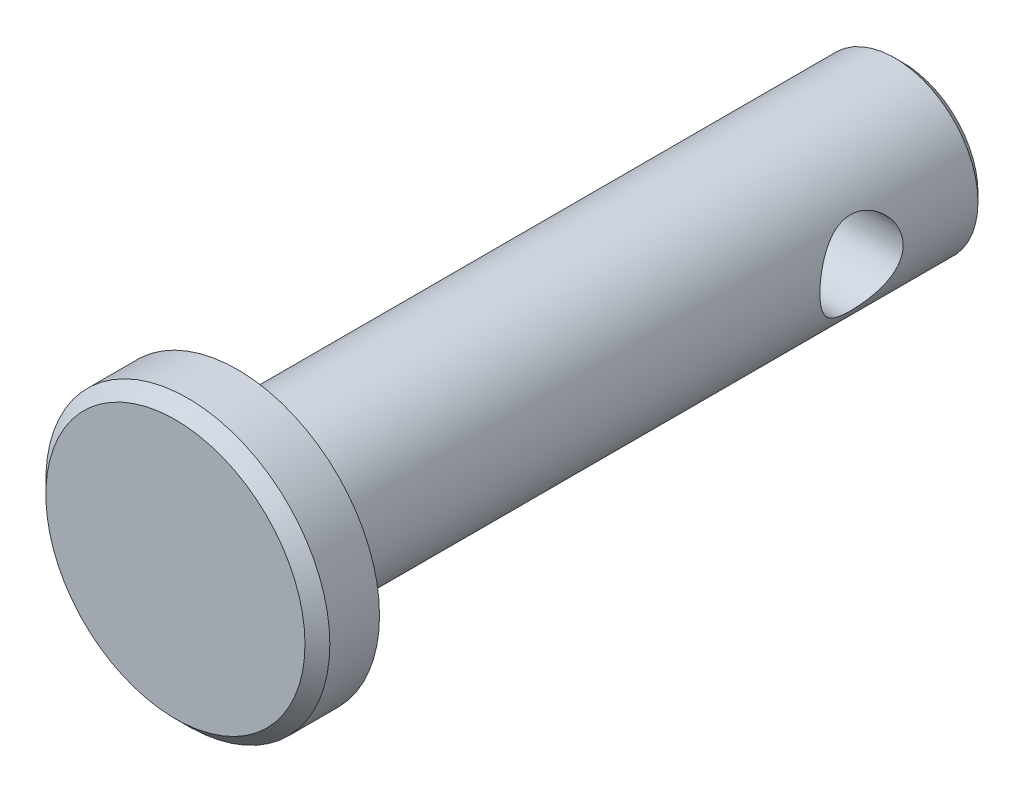
ISO-10303-21;
HEADER;
FILE_DESCRIPTION(('STEP AP214'),'2;1');
FILE_NAME('part.step','',(''),(''),'','','');
FILE_SCHEMA(('AUTOMOTIVE_DESIGN { 1 0 10303 214 1 1 1 1 }'));
ENDSEC;
DATA;
#1=APPLICATION_CONTEXT('core data for automotive mechanical design processes');
#2=APPLICATION_PROTOCOL_DEFINITION('international standard','automotive_design',2000,#1);
#3=PRODUCT_CONTEXT('',#1,'mechanical');
#4=PRODUCT('Part','Part','',(#3));
#5=PRODUCT_RELATED_PRODUCT_CATEGORY('part','',(#4));
#6=PRODUCT_DEFINITION_FORMATION('','',#4);
#7=PRODUCT_DEFINITION_CONTEXT('part definition',#1,'design');
#8=PRODUCT_DEFINITION('design','',#6,#7);
#9=PRODUCT_DEFINITION_SHAPE('','',#8);
#10=(LENGTH_UNIT() NAMED_UNIT(*) SI_UNIT(.MILLI.,.METRE.));
#11=(NAMED_UNIT(*) PLANE_ANGLE_UNIT() SI_UNIT($,.RADIAN.));
#12=(NAMED_UNIT(*) SI_UNIT($,.STERADIAN.) SOLID_ANGLE_UNIT());
#13=UNCERTAINTY_MEASURE_WITH_UNIT(LENGTH_MEASURE(1.E-05),#10,'distance_accuracy_value','');
#14=(GEOMETRIC_REPRESENTATION_CONTEXT(3) GLOBAL_UNCERTAINTY_ASSIGNED_CONTEXT((#13)) GLOBAL_UNIT_ASSIGNED_CONTEXT((#10,
#11,#12)) REPRESENTATION_CONTEXT('',''));
#15=CARTESIAN_POINT('',(0.,0.,0.));
#16=DIRECTION('',(0.,0.,1.));
#17=DIRECTION('',(1.,0.,0.));
#18=AXIS2_PLACEMENT_3D('',#15,#16,#17);
#19=CARTESIAN_POINT('',(0.,0.,9.525));
#20=DIRECTION('',(0.,0.,-1.));
#21=DIRECTION('',(-1.,0.,0.));
#22=AXIS2_PLACEMENT_3D('',#19,#20,#21);
#23=CYLINDRICAL_SURFACE('',#22,2.38125);
#24=CARTESIAN_POINT('',(0.,0.,-9.28687499999998));
#25=DIRECTION('',(0.,0.,1.));
#26=DIRECTION('',(1.,0.,0.));
#27=AXIS2_PLACEMENT_3D('',#24,#25,#26);
#28=CIRCLE('',#27,2.38125);
#29=CARTESIAN_POINT('',(2.38125,0.,-9.28687499999998));
#30=VERTEX_POINT('',#29);
#31=EDGE_CURVE('E37',#30,#30,#28,.T.);
#32=ORIENTED_EDGE('',*,*,#31,.T.);
#33=EDGE_LOOP('',(#32));
#34=FACE_BOUND('',#33,.T.);
#35=CARTESIAN_POINT('',(-2.38125,0.,-4.7625));
#36=CARTESIAN_POINT('',(-2.38124658771817,-0.0625934933908996,-4.76250393182416));
#37=CARTESIAN_POINT('',(-2.37875553370113,-0.12526160776547,-4.7674649933105));
#38=CARTESIAN_POINT('',(-2.36903604532025,-0.248745655116469,-4.78708983565591));
#39=CARTESIAN_POINT('',(-2.36179861446384,-0.309557840743266,-4.80177204291283));
#40=CARTESIAN_POINT('',(-2.34334382664568,-0.427355251873434,-4.84012137838437));
#41=CARTESIAN_POINT('',(-2.33214194770735,-0.484354349749462,-4.86375358874529));
#42=CARTESIAN_POINT('',(-2.30678565164099,-0.593493959385317,-4.91915127106263));
#43=CARTESIAN_POINT('',(-2.29263146732422,-0.645634853781904,-4.95091610174629));
#44=CARTESIAN_POINT('',(-2.26166669988499,-0.747126495522786,-5.02386272516843));
#45=CARTESIAN_POINT('',(-2.24474721461222,-0.796117610742266,-5.0654979643447));
#46=CARTESIAN_POINT('',(-2.2105140207503,-0.886753026544746,-5.1560271362285));
#47=CARTESIAN_POINT('',(-2.19320002298882,-0.928391728636495,-5.20492654851656));
#48=CARTESIAN_POINT('',(-2.15859063769341,-1.00637816303611,-5.31314423802628));
#49=CARTESIAN_POINT('',(-2.14140081986313,-1.04206516514117,-5.3729764170931));
#50=CARTESIAN_POINT('',(-2.11081118475794,-1.10271904514174,-5.49874360940859));
#51=CARTESIAN_POINT('',(-2.09740866244572,-1.12769358094429,-5.56467422201052));
#52=CARTESIAN_POINT('',(-2.07713897941891,-1.16458893898079,-5.69674189114298));
#53=CARTESIAN_POINT('',(-2.06992860854359,-1.1772017235864,-5.76263030074274));
#54=CARTESIAN_POINT('',(-2.06194687719966,-1.19113338890835,-5.89594980373119));
#55=CARTESIAN_POINT('',(-2.06116915374352,-1.19246343021919,-5.96337930647472));
#56=CARTESIAN_POINT('',(-2.06586451337536,-1.18429955128952,-6.08919679770049));
#57=CARTESIAN_POINT('',(-2.07060121735085,-1.17608099119853,-6.14770173717495));
#58=CARTESIAN_POINT('',(-2.0845013483624,-1.15126275778341,-6.26235639834728));
#59=CARTESIAN_POINT('',(-2.09366618546583,-1.13466041470314,-6.31850536362914));
#60=CARTESIAN_POINT('',(-2.1155915160392,-1.09324351977209,-6.42845718596099));
#61=CARTESIAN_POINT('',(-2.12843079040573,-1.06824668928498,-6.48217493105433));
#62=CARTESIAN_POINT('',(-2.15626240722546,-1.01089025937972,-6.58491145461498));
#63=CARTESIAN_POINT('',(-2.17125571566414,-0.978527352789222,-6.63392810832386));
#64=CARTESIAN_POINT('',(-2.20400353628599,-0.902572396630542,-6.73241436654741));
#65=CARTESIAN_POINT('',(-2.22186710625626,-0.858076839495929,-6.78115334010162));
#66=CARTESIAN_POINT('',(-2.25680138992047,-0.761470860938951,-6.8707818577598));
#67=CARTESIAN_POINT('',(-2.27387172175947,-0.709356821108762,-6.91166765051535));
#68=CARTESIAN_POINT('',(-2.30626428608779,-0.595927464756048,-6.98621324016352));
#69=CARTESIAN_POINT('',(-2.3214685301789,-0.534297244998049,-7.01944931250571));
#70=CARTESIAN_POINT('',(-2.34741102209979,-0.405367587816352,-7.07480927520434));
#71=CARTESIAN_POINT('',(-2.35815281492167,-0.338072701740848,-7.09694198903369));
#72=CARTESIAN_POINT('',(-2.37320534860897,-0.205700104133525,-7.12764727755017));
#73=CARTESIAN_POINT('',(-2.37797504664999,-0.140900384809101,-7.13719112756101));
#74=CARTESIAN_POINT('',(-2.38211931649743,-0.0104532111897013,-7.14549394550701));
#75=CARTESIAN_POINT('',(-2.38149644415062,0.0551938267825994,-7.14425802258951));
#76=CARTESIAN_POINT('',(-2.37519200776753,0.180061757270822,-7.13159766160143));
#77=CARTESIAN_POINT('',(-2.36990626897501,0.239386357709476,-7.12097032821831));
#78=CARTESIAN_POINT('',(-2.35532022721706,0.355290706146969,-7.09107904564992));
#79=CARTESIAN_POINT('',(-2.34601948166815,0.411870150775842,-7.07181414431648));
#80=CARTESIAN_POINT('',(-2.323912493394,0.522551749435383,-7.02468932590301));
#81=CARTESIAN_POINT('',(-2.31101362357334,0.576536816435452,-6.99659940595468));
#82=CARTESIAN_POINT('',(-2.28295169421308,0.679205558772778,-6.93288134037144));
#83=CARTESIAN_POINT('',(-2.26778767095513,0.727886962326196,-6.8972499834997));
#84=CARTESIAN_POINT('',(-2.23490101029918,0.823635905061685,-6.81542274358805));
#85=CARTESIAN_POINT('',(-2.21707334772675,0.870075505159962,-6.76853302224748));
#86=CARTESIAN_POINT('',(-2.18196785003363,0.954710182325452,-6.66758911676999));
#87=CARTESIAN_POINT('',(-2.1646904022613,0.992899556088159,-6.61353001790926));
#88=CARTESIAN_POINT('',(-2.13182825744162,1.06168973569882,-6.49647427421776));
#89=CARTESIAN_POINT('',(-2.11636605630571,1.0918334810305,-6.4331715861704));
#90=CARTESIAN_POINT('',(-2.090428799133,1.14071736472269,-6.3013708256536));
#91=CARTESIAN_POINT('',(-2.07994732092736,1.15947219672864,-6.23287957625953));
#92=CARTESIAN_POINT('',(-2.06646662138444,1.18331657161978,-6.09967876590559));
#93=CARTESIAN_POINT('',(-2.06284572182647,1.18954509883978,-6.03523734201106));
#94=CARTESIAN_POINT('',(-2.06175000375602,1.19144552443463,-5.90615833564986));
#95=CARTESIAN_POINT('',(-2.06427252119055,1.18712199863718,-5.84152085034462));
#96=CARTESIAN_POINT('',(-2.0745195450331,1.16910579328329,-5.72037745598845));
#97=CARTESIAN_POINT('',(-2.081725593681,1.1563448992644,-5.66368350273433));
#98=CARTESIAN_POINT('',(-2.09991741148739,1.12296816088622,-5.55330345780996));
#99=CARTESIAN_POINT('',(-2.11090439637645,1.10234978978715,-5.49961834007176));
#100=CARTESIAN_POINT('',(-2.13632093965266,1.05229312174863,-5.39278728679408));
#101=CARTESIAN_POINT('',(-2.15093219477964,1.02235532346272,-5.33991990438402));
#102=CARTESIAN_POINT('',(-2.18164566727434,0.955061000604871,-5.23961375535999));
#103=CARTESIAN_POINT('',(-2.19774865799103,0.91770061638102,-5.19217783335143));
#104=CARTESIAN_POINT('',(-2.23197328511557,0.831298335810092,-5.09808720225547));
#105=CARTESIAN_POINT('',(-2.25010245755217,0.781388641146489,-5.05222775625034));
#106=CARTESIAN_POINT('',(-2.28454448778714,0.674078066156024,-4.96935563536124));
#107=CARTESIAN_POINT('',(-2.30085636405197,0.616673173627613,-4.93234772899558));
#108=CARTESIAN_POINT('',(-2.33002942662263,0.495218557463752,-4.86818420558625));
#109=CARTESIAN_POINT('',(-2.34286539970213,0.431124721872153,-4.84110009829451));
#110=CARTESIAN_POINT('',(-2.36340659560876,0.298539814353399,-4.7984471500715));
#111=CARTESIAN_POINT('',(-2.37112639390897,0.230061848926334,-4.78284558236853));
#112=CARTESIAN_POINT('',(-2.37762409336193,0.134066692531781,-4.76976589493782));
#113=CARTESIAN_POINT('',(-2.37898025606987,0.107348987707655,-4.76704504322175));
#114=CARTESIAN_POINT('',(-2.3807939546427,0.0537587806828981,-4.76341122636905));
#115=CARTESIAN_POINT('',(-2.38125146570418,0.026886274230164,-4.76249831113273));
#116=CARTESIAN_POINT('',(-2.38125,0.,-4.7625));
#117=B_SPLINE_CURVE_WITH_KNOTS('',3,(#35,#36,#37,#38,#39,#40,#41,#42,#43,#44,#45,#46,#47,#48,
#49,#50,#51,#52,#53,#54,#55,#56,#57,#58,#59,#60,#61,#62,#63,#64,#65,#66,#67,#68,#69,#70,#71,#72,
#73,#74,#75,#76,#77,#78,#79,#80,#81,#82,#83,#84,#85,#86,#87,#88,#89,#90,#91,#92,#93,#94,#95,#96,
#97,#98,#99,#100,#101,#102,#103,#104,#105,#106,#107,#108,#109,#110,#111,#112,#113,#114,#115,
#116),.UNSPECIFIED.,.T.,.F.,(4,2,2,2,2,2,2,2,2,2,2,2,2,2,2,2,2,2,2,2,2,2,2,2,2,2,2,2,2,2,2,2,2,
2,2,2,2,2,2,2,4),(0.,0.187671381491036,0.375699515747514,0.563001503883018,0.75028872744243,
0.948906406473726,1.14767467670684,1.36185743031615,1.57588681716391,1.77710320704461,
1.97812053569865,2.15509926337348,2.33213438424011,2.51329317200606,2.69453345625452,
2.8987544577565,3.10307277131562,3.31687910824069,3.53051527011183,3.72645730217447,
3.92230647121477,4.10297598058852,4.28366541066829,4.46952119208218,4.65545627297242,
4.85965036423512,5.06398516445249,5.27821543446363,5.49216872029489,5.68558331740252,
5.8789140564582,6.05382723196981,6.22879670208068,6.41552156348467,6.60234377481073,
6.81186617152195,7.02150118957733,7.23261841267422,7.44313156831559,7.52374130413948,
7.60435326481741),.UNSPECIFIED.);
#118=CARTESIAN_POINT('',(-2.38125,0.,-4.7625));
#119=VERTEX_POINT('',#118);
#120=EDGE_CURVE('E48',#119,#119,#117,.T.);
#121=ORIENTED_EDGE('',*,*,#120,.T.);
#122=EDGE_LOOP('',(#121));
#123=FACE_BOUND('',#122,.T.);
#124=CARTESIAN_POINT('',(2.38125,0.,-7.14375000000001));
#125=CARTESIAN_POINT('',(2.38124658771817,-0.0625934933908996,-7.14374606817585));
#126=CARTESIAN_POINT('',(2.37875553370113,-0.12526160776547,-7.13878500668951));
#127=CARTESIAN_POINT('',(2.36903604532025,-0.248745655116469,-7.1191601643441));
#128=CARTESIAN_POINT('',(2.36179861446383,-0.309557840743266,-7.10447795708718));
#129=CARTESIAN_POINT('',(2.34334382664568,-0.427355251873435,-7.06612862161564));
#130=CARTESIAN_POINT('',(2.33214194770735,-0.484354349749463,-7.04249641125472));
#131=CARTESIAN_POINT('',(2.30678565164099,-0.593493959385318,-6.98709872893737));
#132=CARTESIAN_POINT('',(2.29263146732421,-0.645634853781905,-6.95533389825372));
#133=CARTESIAN_POINT('',(2.26166669988499,-0.747126495522787,-6.88238727483157));
#134=CARTESIAN_POINT('',(2.24474721461222,-0.796117610742267,-6.84075203565531));
#135=CARTESIAN_POINT('',(2.2105140207503,-0.886753026544747,-6.75022286377151));
#136=CARTESIAN_POINT('',(2.19320002298882,-0.928391728636496,-6.70132345148344));
#137=CARTESIAN_POINT('',(2.15859063769341,-1.00637816303612,-6.59310576197373));
#138=CARTESIAN_POINT('',(2.14140081986313,-1.04206516514117,-6.5332735829069));
#139=CARTESIAN_POINT('',(2.11081118475794,-1.10271904514174,-6.40750639059142));
#140=CARTESIAN_POINT('',(2.09740866244572,-1.12769358094429,-6.34157577798948));
#141=CARTESIAN_POINT('',(2.07713897941891,-1.16458893898079,-6.20950810885703));
#142=CARTESIAN_POINT('',(2.06992860854359,-1.1772017235864,-6.14361969925726));
#143=CARTESIAN_POINT('',(2.06194687719966,-1.19113338890835,-6.01030019626882));
#144=CARTESIAN_POINT('',(2.06116915374352,-1.19246343021919,-5.94287069352529));
#145=CARTESIAN_POINT('',(2.06586451337536,-1.18429955128952,-5.81705320229952));
#146=CARTESIAN_POINT('',(2.07060121735085,-1.17608099119853,-5.75854826282506));
#147=CARTESIAN_POINT('',(2.0845013483624,-1.15126275778341,-5.64389360165273));
#148=CARTESIAN_POINT('',(2.09366618546583,-1.13466041470314,-5.58774463637086));
#149=CARTESIAN_POINT('',(2.1155915160392,-1.09324351977209,-5.47779281403902));
#150=CARTESIAN_POINT('',(2.12843079040573,-1.06824668928498,-5.42407506894567));
#151=CARTESIAN_POINT('',(2.15626240722546,-1.01089025937972,-5.32133854538502));
#152=CARTESIAN_POINT('',(2.17125571566414,-0.978527352789222,-5.27232189167615));
#153=CARTESIAN_POINT('',(2.204003536286,-0.902572396630541,-5.1738356334526));
#154=CARTESIAN_POINT('',(2.22186710625626,-0.858076839495928,-5.12509665989839));
#155=CARTESIAN_POINT('',(2.25680138992047,-0.76147086093895,-5.03546814224021));
#156=CARTESIAN_POINT('',(2.27387172175947,-0.709356821108761,-4.99458234948466));
#157=CARTESIAN_POINT('',(2.30626428608779,-0.595927464756046,-4.92003675983648));
#158=CARTESIAN_POINT('',(2.3214685301789,-0.534297244998047,-4.88680068749429));
#159=CARTESIAN_POINT('',(2.34741102209979,-0.40536758781635,-4.83144072479567));
#160=CARTESIAN_POINT('',(2.35815281492167,-0.338072701740845,-4.80930801096632));
#161=CARTESIAN_POINT('',(2.37320534860897,-0.205700104133523,-4.77860272244983));
#162=CARTESIAN_POINT('',(2.37797504664999,-0.140900384809099,-4.76905887243899));
#163=CARTESIAN_POINT('',(2.38211931649743,-0.0104532111896994,-4.760756054493));
#164=CARTESIAN_POINT('',(2.38149644415062,0.0551938267826012,-4.7619919774105));
#165=CARTESIAN_POINT('',(2.37519200776753,0.180061757270824,-4.77465233839858));
#166=CARTESIAN_POINT('',(2.36990626897501,0.239386357709477,-4.78527967178169));
#167=CARTESIAN_POINT('',(2.35532022721706,0.35529070614697,-4.81517095435009));
#168=CARTESIAN_POINT('',(2.34601948166815,0.411870150775843,-4.83443585568353));
#169=CARTESIAN_POINT('',(2.323912493394,0.522551749435383,-4.881560674097));
#170=CARTESIAN_POINT('',(2.31101362357334,0.576536816435452,-4.90965059404533));
#171=CARTESIAN_POINT('',(2.28295169421308,0.679205558772778,-4.97336865962857));
#172=CARTESIAN_POINT('',(2.26778767095513,0.727886962326196,-5.00900001650031));
#173=CARTESIAN_POINT('',(2.23490101029918,0.823635905061685,-5.09082725641195));
#174=CARTESIAN_POINT('',(2.21707334772675,0.870075505159962,-5.13771697775253));
#175=CARTESIAN_POINT('',(2.18196785003363,0.954710182325452,-5.23866088323001));
#176=CARTESIAN_POINT('',(2.1646904022613,0.992899556088159,-5.29271998209074));
#177=CARTESIAN_POINT('',(2.13182825744162,1.06168973569882,-5.40977572578225));
#178=CARTESIAN_POINT('',(2.11636605630571,1.0918334810305,-5.47307841382961));
#179=CARTESIAN_POINT('',(2.090428799133,1.14071736472269,-5.60487917434641));
#180=CARTESIAN_POINT('',(2.07994732092736,1.15947219672864,-5.67337042374048));
#181=CARTESIAN_POINT('',(2.06646662138444,1.18331657161978,-5.80657123409441));
#182=CARTESIAN_POINT('',(2.06284572182647,1.18954509883978,-5.87101265798895));
#183=CARTESIAN_POINT('',(2.06175000375602,1.19144552443463,-6.00009166435015));
#184=CARTESIAN_POINT('',(2.06427252119055,1.18712199863718,-6.06472914965539));
#185=CARTESIAN_POINT('',(2.0745195450331,1.16910579328329,-6.18587254401156));
#186=CARTESIAN_POINT('',(2.081725593681,1.1563448992644,-6.24256649726568));
#187=CARTESIAN_POINT('',(2.09991741148739,1.12296816088622,-6.35294654219004));
#188=CARTESIAN_POINT('',(2.11090439637645,1.10234978978715,-6.40663165992825));
#189=CARTESIAN_POINT('',(2.13632093965266,1.05229312174863,-6.51346271320593));
#190=CARTESIAN_POINT('',(2.15093219477964,1.02235532346272,-6.56633009561599));
#191=CARTESIAN_POINT('',(2.18164566727434,0.95506100060487,-6.66663624464002));
#192=CARTESIAN_POINT('',(2.19774865799103,0.917700616381018,-6.71407216664858));
#193=CARTESIAN_POINT('',(2.23197328511557,0.831298335810091,-6.80816279774454));
#194=CARTESIAN_POINT('',(2.25010245755217,0.781388641146488,-6.85402224374967));
#195=CARTESIAN_POINT('',(2.28454448778714,0.674078066156023,-6.93689436463877));
#196=CARTESIAN_POINT('',(2.30085636405197,0.616673173627612,-6.97390227100443));
#197=CARTESIAN_POINT('',(2.33002942662263,0.495218557463752,-7.03806579441375));
#198=CARTESIAN_POINT('',(2.34286539970213,0.431124721872153,-7.0651499017055));
#199=CARTESIAN_POINT('',(2.36340659560876,0.298539814353399,-7.10780284992851));
#200=CARTESIAN_POINT('',(2.37112639390897,0.230061848926335,-7.12340441763147));
#201=CARTESIAN_POINT('',(2.37762409336193,0.134066692531781,-7.13648410506219));
#202=CARTESIAN_POINT('',(2.37898025606987,0.107348987707655,-7.13920495677825));
#203=CARTESIAN_POINT('',(2.3807939546427,0.0537587806828979,-7.14283877363095));
#204=CARTESIAN_POINT('',(2.38125146570418,0.0268862742301639,-7.14375168886728));
#205=CARTESIAN_POINT('',(2.38125,0.,-7.14375000000001));
#206=B_SPLINE_CURVE_WITH_KNOTS('',3,(#124,#125,#126,#127,#128,#129,#130,#131,#132,#133,#134,
#135,#136,#137,#138,#139,#140,#141,#142,#143,#144,#145,#146,#147,#148,#149,#150,#151,#152,#153,
#154,#155,#156,#157,#158,#159,#160,#161,#162,#163,#164,#165,#166,#167,#168,#169,#170,#171,#172,
#173,#174,#175,#176,#177,#178,#179,#180,#181,#182,#183,#184,#185,#186,#187,#188,#189,#190,#191,
#192,#193,#194,#195,#196,#197,#198,#199,#200,#201,#202,#203,#204,#205),.UNSPECIFIED.,.T.,.F.,(4,
2,2,2,2,2,2,2,2,2,2,2,2,2,2,2,2,2,2,2,2,2,2,2,2,2,2,2,2,2,2,2,2,2,2,2,2,2,2,2,4),(0.,
0.187671381491036,0.375699515747514,0.563001503883019,0.750288727442431,0.948906406473727,
1.14767467670684,1.36185743031615,1.57588681716391,1.77710320704461,1.97812053569865,
2.15509926337348,2.33213438424011,2.51329317200606,2.69453345625452,2.8987544577565,
3.10307277131562,3.31687910824069,3.53051527011184,3.72645730217447,3.92230647121477,
4.10297598058852,4.28366541066829,4.46952119208218,4.65545627297242,4.85965036423512,
5.06398516445249,5.27821543446363,5.49216872029489,5.68558331740252,5.8789140564582,
6.05382723196981,6.22879670208068,6.41552156348467,6.60234377481073,6.81186617152195,
7.02150118957733,7.23261841267422,7.44313156831559,7.52374130413948,7.60435326481741),.UNSPECIFIED.);
#207=CARTESIAN_POINT('',(2.38125,0.,-7.14375000000001));
#208=VERTEX_POINT('',#207);
#209=EDGE_CURVE('E56',#208,#208,#206,.T.);
#210=ORIENTED_EDGE('',*,*,#209,.T.);
#211=EDGE_LOOP('',(#210));
#212=FACE_BOUND('',#211,.T.);
#213=CARTESIAN_POINT('',(0.,0.,9.525));
#214=DIRECTION('',(0.,0.,1.));
#215=DIRECTION('',(1.,0.,0.));
#216=AXIS2_PLACEMENT_3D('',#213,#214,#215);
#217=CIRCLE('',#216,2.38125);
#218=CARTESIAN_POINT('',(2.38125,0.,9.525));
#219=VERTEX_POINT('',#218);
#220=EDGE_CURVE('E94',#219,#219,#217,.T.);
#221=ORIENTED_EDGE('',*,*,#220,.F.);
#222=EDGE_LOOP('',(#221));
#223=FACE_BOUND('',#222,.T.);
#224=ADVANCED_FACE('F30',(#34,#123,#212,#223),#23,.T.);
#225=CARTESIAN_POINT('',(0.,0.,-9.525));
#226=DIRECTION('',(0.,0.,1.));
#227=DIRECTION('',(1.,0.,0.));
#228=AXIS2_PLACEMENT_3D('',#225,#226,#227);
#229=PLANE('',#228);
#230=CARTESIAN_POINT('',(0.,0.,-9.525));
#231=DIRECTION('',(0.,0.,1.));
#232=DIRECTION('',(1.,0.,0.));
#233=AXIS2_PLACEMENT_3D('',#230,#231,#232);
#234=CIRCLE('',#233,2.14312499999998);
#235=CARTESIAN_POINT('',(2.14312499999998,0.,-9.525));
#236=VERTEX_POINT('',#235);
#237=EDGE_CURVE('E10',#236,#236,#234,.F.);
#238=ORIENTED_EDGE('',*,*,#237,.T.);
#239=EDGE_LOOP('',(#238));
#240=FACE_BOUND('',#239,.T.);
#241=ADVANCED_FACE('F76',(#240),#229,.F.);
#242=CARTESIAN_POINT('',(0.,0.,9.525));
#243=DIRECTION('',(0.,0.,1.));
#244=DIRECTION('',(1.,0.,0.));
#245=AXIS2_PLACEMENT_3D('',#242,#243,#244);
#246=PLANE('',#245);
#247=CARTESIAN_POINT('',(0.,0.,9.525));
#248=DIRECTION('',(0.,0.,1.));
#249=DIRECTION('',(1.,0.,0.));
#250=AXIS2_PLACEMENT_3D('',#247,#248,#249);
#251=CIRCLE('',#250,4.064);
#252=CARTESIAN_POINT('',(4.064,0.,9.525));
#253=VERTEX_POINT('',#252);
#254=EDGE_CURVE('E55',#253,#253,#251,.T.);
#255=ORIENTED_EDGE('',*,*,#254,.F.);
#256=EDGE_LOOP('',(#255));
#257=FACE_BOUND('',#256,.T.);
#258=ORIENTED_EDGE('',*,*,#220,.T.);
#259=EDGE_LOOP('',(#258));
#260=FACE_BOUND('',#259,.T.);
#261=ADVANCED_FACE('F73',(#257,#260),#246,.F.);
#262=CARTESIAN_POINT('',(0.,0.,11.303));
#263=DIRECTION('',(0.,0.,-1.));
#264=DIRECTION('',(-1.,0.,0.));
#265=AXIS2_PLACEMENT_3D('',#262,#263,#264);
#266=CYLINDRICAL_SURFACE('',#265,4.064);
#267=CARTESIAN_POINT('',(0.,0.,10.9474));
#268=DIRECTION('',(0.,0.,1.));
#269=DIRECTION('',(1.,0.,0.));
#270=AXIS2_PLACEMENT_3D('',#267,#268,#269);
#271=CIRCLE('',#270,4.064);
#272=CARTESIAN_POINT('',(4.064,0.,10.9474));
#273=VERTEX_POINT('',#272);
#274=EDGE_CURVE('E41',#273,#273,#271,.F.);
#275=ORIENTED_EDGE('',*,*,#274,.T.);
#276=EDGE_LOOP('',(#275));
#277=FACE_BOUND('',#276,.T.);
#278=ORIENTED_EDGE('',*,*,#254,.T.);
#279=EDGE_LOOP('',(#278));
#280=FACE_BOUND('',#279,.T.);
#281=ADVANCED_FACE('F71',(#277,#280),#266,.T.);
#282=CARTESIAN_POINT('',(0.,0.,11.303));
#283=DIRECTION('',(0.,0.,1.));
#284=DIRECTION('',(1.,0.,0.));
#285=AXIS2_PLACEMENT_3D('',#282,#283,#284);
#286=PLANE('',#285);
#287=CARTESIAN_POINT('',(0.,0.,11.303));
#288=DIRECTION('',(0.,0.,1.));
#289=DIRECTION('',(1.,0.,0.));
#290=AXIS2_PLACEMENT_3D('',#287,#288,#289);
#291=CIRCLE('',#290,3.7084);
#292=CARTESIAN_POINT('',(3.7084,0.,11.303));
#293=VERTEX_POINT('',#292);
#294=EDGE_CURVE('E45',#293,#293,#291,.T.);
#295=ORIENTED_EDGE('',*,*,#294,.T.);
#296=EDGE_LOOP('',(#295));
#297=FACE_BOUND('',#296,.T.);
#298=ADVANCED_FACE('F67',(#297),#286,.T.);
#299=CARTESIAN_POINT('',(0.,0.,11.303));
#300=DIRECTION('',(0.,0.,-1.));
#301=DIRECTION('',(-1.,0.,0.));
#302=AXIS2_PLACEMENT_3D('',#299,#300,#301);
#303=CONICAL_SURFACE('',#302,3.7084,0.785398163397443);
#304=ORIENTED_EDGE('',*,*,#274,.F.);
#305=EDGE_LOOP('',(#304));
#306=FACE_BOUND('',#305,.T.);
#307=ORIENTED_EDGE('',*,*,#294,.F.);
#308=EDGE_LOOP('',(#307));
#309=FACE_BOUND('',#308,.T.);
#310=ADVANCED_FACE('F65',(#306,#309),#303,.T.);
#311=CARTESIAN_POINT('',(-4.064,0.,-5.953125));
#312=DIRECTION('',(1.,0.,0.));
#313=DIRECTION('',(0.,0.,-1.));
#314=AXIS2_PLACEMENT_3D('',#311,#312,#313);
#315=CYLINDRICAL_SURFACE('',#314,1.190625);
#316=ORIENTED_EDGE('',*,*,#209,.F.);
#317=EDGE_LOOP('',(#316));
#318=FACE_BOUND('',#317,.T.);
#319=ORIENTED_EDGE('',*,*,#120,.F.);
#320=EDGE_LOOP('',(#319));
#321=FACE_BOUND('',#320,.T.);
#322=ADVANCED_FACE('F61',(#318,#321),#315,.F.);
#323=CARTESIAN_POINT('',(0.,0.,-9.28687499999998));
#324=DIRECTION('',(0.,0.,1.));
#325=DIRECTION('',(1.,0.,0.));
#326=AXIS2_PLACEMENT_3D('',#323,#324,#325);
#327=CONICAL_SURFACE('',#326,2.38125,0.785398163397446);
#328=ORIENTED_EDGE('',*,*,#237,.F.);
#329=EDGE_LOOP('',(#328));
#330=FACE_BOUND('',#329,.T.);
#331=ORIENTED_EDGE('',*,*,#31,.F.);
#332=EDGE_LOOP('',(#331));
#333=FACE_BOUND('',#332,.T.);
#334=ADVANCED_FACE('F32',(#330,#333),#327,.T.);
#335=CLOSED_SHELL('',(#224,#241,#261,#281,#298,#310,#322,#334));
#336=MANIFOLD_SOLID_BREP('B2',#335);
#337=ADVANCED_BREP_SHAPE_REPRESENTATION('',(#18,#336),#14);
#338=SHAPE_DEFINITION_REPRESENTATION(#9,#337);
ENDSEC;
END-ISO-10303-21;
